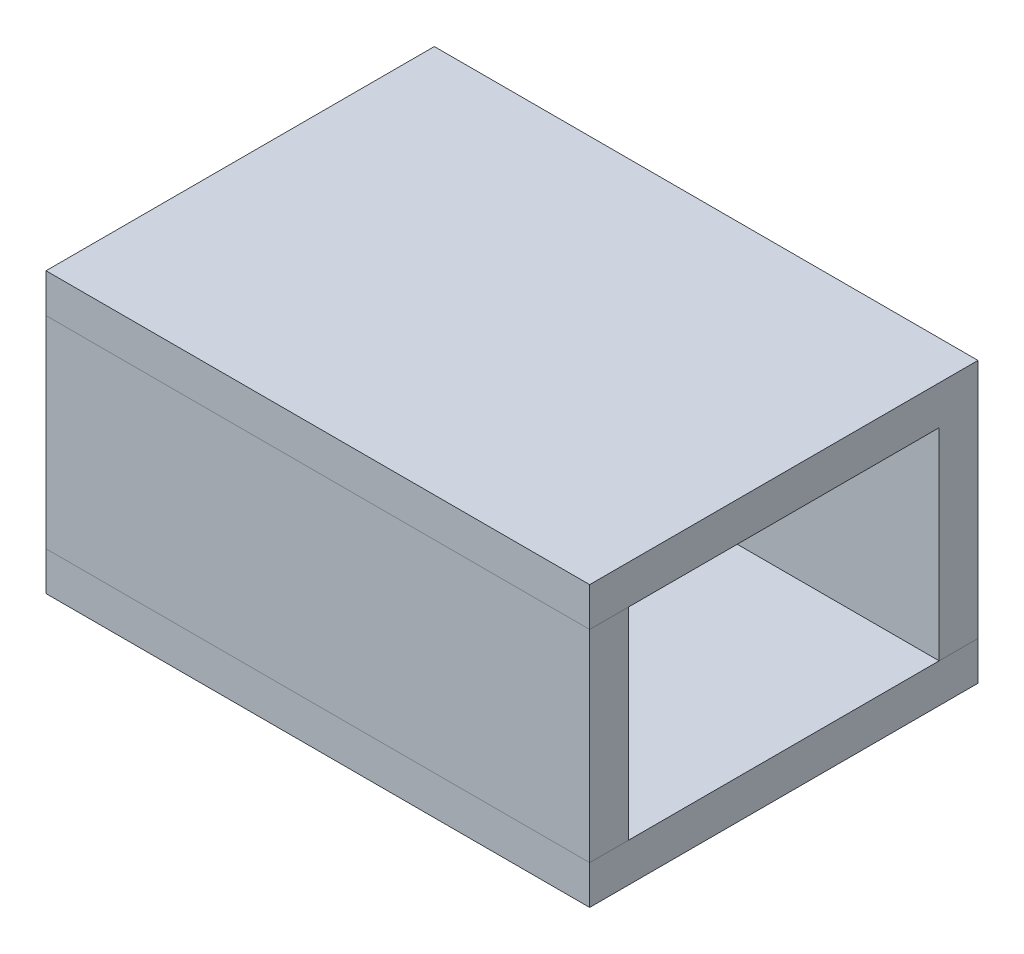
ISO-10303-21;
HEADER;
FILE_DESCRIPTION(('STEP AP214'),'2;1');
FILE_NAME('part.step','',(''),(''),'','','');
FILE_SCHEMA(('AUTOMOTIVE_DESIGN { 1 0 10303 214 1 1 1 1 }'));
ENDSEC;
DATA;
#1=APPLICATION_CONTEXT('core data for automotive mechanical design processes');
#2=APPLICATION_PROTOCOL_DEFINITION('international standard','automotive_design',2000,#1);
#3=PRODUCT_CONTEXT('',#1,'mechanical');
#4=PRODUCT('Part','Part','',(#3));
#5=PRODUCT_RELATED_PRODUCT_CATEGORY('part','',(#4));
#6=PRODUCT_DEFINITION_FORMATION('','',#4);
#7=PRODUCT_DEFINITION_CONTEXT('part definition',#1,'design');
#8=PRODUCT_DEFINITION('design','',#6,#7);
#9=PRODUCT_DEFINITION_SHAPE('','',#8);
#10=(LENGTH_UNIT() NAMED_UNIT(*) SI_UNIT(.MILLI.,.METRE.));
#11=(NAMED_UNIT(*) PLANE_ANGLE_UNIT() SI_UNIT($,.RADIAN.));
#12=(NAMED_UNIT(*) SI_UNIT($,.STERADIAN.) SOLID_ANGLE_UNIT());
#13=UNCERTAINTY_MEASURE_WITH_UNIT(LENGTH_MEASURE(1.E-05),#10,'distance_accuracy_value','');
#14=(GEOMETRIC_REPRESENTATION_CONTEXT(3) GLOBAL_UNCERTAINTY_ASSIGNED_CONTEXT((#13)) GLOBAL_UNIT_ASSIGNED_CONTEXT((#10,
#11,#12)) REPRESENTATION_CONTEXT('',''));
#15=CARTESIAN_POINT('',(0.,0.,0.));
#16=DIRECTION('',(0.,0.,1.));
#17=DIRECTION('',(1.,0.,0.));
#18=AXIS2_PLACEMENT_3D('',#15,#16,#17);
#19=CARTESIAN_POINT('',(0.,-6.5,10.));
#20=DIRECTION('',(0.,1.,0.));
#21=DIRECTION('',(0.,0.,1.));
#22=AXIS2_PLACEMENT_3D('',#19,#20,#21);
#23=PLANE('',#22);
#24=DIRECTION('',(0.,0.,-1.));
#25=VECTOR('',#24,1.);
#26=CARTESIAN_POINT('',(0.,-6.5,0.));
#27=LINE('',#26,#25);
#28=CARTESIAN_POINT('',(0.,-6.5,-10.));
#29=VERTEX_POINT('',#28);
#30=CARTESIAN_POINT('',(0.,-6.5,-12.5));
#31=VERTEX_POINT('',#30);
#32=EDGE_CURVE('E133',#29,#31,#27,.T.);
#33=ORIENTED_EDGE('',*,*,#32,.T.);
#34=DIRECTION('',(-1.,0.,0.));
#35=VECTOR('',#34,1.);
#36=CARTESIAN_POINT('',(35.,-6.5,-12.5));
#37=LINE('',#36,#35);
#38=CARTESIAN_POINT('',(35.,-6.5,-12.5));
#39=VERTEX_POINT('',#38);
#40=EDGE_CURVE('E71',#39,#31,#37,.T.);
#41=ORIENTED_EDGE('',*,*,#40,.F.);
#42=DIRECTION('',(0.,0.,-1.));
#43=VECTOR('',#42,1.);
#44=CARTESIAN_POINT('',(35.,-6.5,0.));
#45=LINE('',#44,#43);
#46=CARTESIAN_POINT('',(35.,-6.5,-10.));
#47=VERTEX_POINT('',#46);
#48=EDGE_CURVE('E79',#47,#39,#45,.T.);
#49=ORIENTED_EDGE('',*,*,#48,.F.);
#50=DIRECTION('',(-1.,0.,0.));
#51=VECTOR('',#50,1.);
#52=CARTESIAN_POINT('',(35.,-6.5,-10.));
#53=LINE('',#52,#51);
#54=EDGE_CURVE('E122',#47,#29,#53,.T.);
#55=ORIENTED_EDGE('',*,*,#54,.T.);
#56=EDGE_LOOP('',(#33,#41,#49,#55));
#57=FACE_BOUND('',#56,.T.);
#58=ADVANCED_FACE('F53',(#57),#23,.F.);
#59=CARTESIAN_POINT('',(35.,0.,0.));
#60=DIRECTION('',(-1.,0.,0.));
#61=DIRECTION('',(0.,0.,1.));
#62=AXIS2_PLACEMENT_3D('',#59,#60,#61);
#63=PLANE('',#62);
#64=DIRECTION('',(0.,1.,0.));
#65=VECTOR('',#64,1.);
#66=CARTESIAN_POINT('',(35.,-9.,-12.5));
#67=LINE('',#66,#65);
#68=CARTESIAN_POINT('',(35.,9.,-12.5));
#69=VERTEX_POINT('',#68);
#70=EDGE_CURVE('E57',#39,#69,#67,.T.);
#71=ORIENTED_EDGE('',*,*,#70,.T.);
#72=DIRECTION('',(0.,0.,1.));
#73=VECTOR('',#72,1.);
#74=CARTESIAN_POINT('',(35.,9.,12.5));
#75=LINE('',#74,#73);
#76=CARTESIAN_POINT('',(35.,9.,12.5));
#77=VERTEX_POINT('',#76);
#78=EDGE_CURVE('E160',#69,#77,#75,.T.);
#79=ORIENTED_EDGE('',*,*,#78,.T.);
#80=DIRECTION('',(0.,-1.,0.));
#81=VECTOR('',#80,1.);
#82=CARTESIAN_POINT('',(35.,-9.,12.5));
#83=LINE('',#82,#81);
#84=CARTESIAN_POINT('',(35.,6.5,12.5));
#85=VERTEX_POINT('',#84);
#86=EDGE_CURVE('E157',#77,#85,#83,.T.);
#87=ORIENTED_EDGE('',*,*,#86,.T.);
#88=DIRECTION('',(0.,0.,1.));
#89=VECTOR('',#88,1.);
#90=CARTESIAN_POINT('',(35.,6.5,0.));
#91=LINE('',#90,#89);
#92=CARTESIAN_POINT('',(35.,6.5,-10.));
#93=VERTEX_POINT('',#92);
#94=EDGE_CURVE('E151',#93,#85,#91,.T.);
#95=ORIENTED_EDGE('',*,*,#94,.F.);
#96=DIRECTION('',(0.,1.,0.));
#97=VECTOR('',#96,1.);
#98=CARTESIAN_POINT('',(35.,0.,-10.));
#99=LINE('',#98,#97);
#100=EDGE_CURVE('E63',#47,#93,#99,.T.);
#101=ORIENTED_EDGE('',*,*,#100,.F.);
#102=ORIENTED_EDGE('',*,*,#48,.T.);
#103=EDGE_LOOP('',(#71,#79,#87,#95,#101,#102));
#104=FACE_BOUND('',#103,.T.);
#105=ADVANCED_FACE('F189',(#104),#63,.F.);
#106=CARTESIAN_POINT('',(0.,0.,0.));
#107=DIRECTION('',(-1.,0.,0.));
#108=DIRECTION('',(0.,0.,1.));
#109=AXIS2_PLACEMENT_3D('',#106,#107,#108);
#110=PLANE('',#109);
#111=DIRECTION('',(0.,1.,0.));
#112=VECTOR('',#111,1.);
#113=CARTESIAN_POINT('',(0.,0.,-10.));
#114=LINE('',#113,#112);
#115=CARTESIAN_POINT('',(0.,6.5,-10.));
#116=VERTEX_POINT('',#115);
#117=EDGE_CURVE('E13',#29,#116,#114,.T.);
#118=ORIENTED_EDGE('',*,*,#117,.T.);
#119=DIRECTION('',(0.,0.,1.));
#120=VECTOR('',#119,1.);
#121=CARTESIAN_POINT('',(0.,6.5,0.));
#122=LINE('',#121,#120);
#123=CARTESIAN_POINT('',(0.,6.5,12.5));
#124=VERTEX_POINT('',#123);
#125=EDGE_CURVE('E110',#116,#124,#122,.T.);
#126=ORIENTED_EDGE('',*,*,#125,.T.);
#127=DIRECTION('',(0.,-1.,0.));
#128=VECTOR('',#127,1.);
#129=CARTESIAN_POINT('',(0.,-9.,12.5));
#130=LINE('',#129,#128);
#131=CARTESIAN_POINT('',(0.,9.,12.5));
#132=VERTEX_POINT('',#131);
#133=EDGE_CURVE('E162',#132,#124,#130,.T.);
#134=ORIENTED_EDGE('',*,*,#133,.F.);
#135=DIRECTION('',(0.,0.,1.));
#136=VECTOR('',#135,1.);
#137=CARTESIAN_POINT('',(0.,9.,12.5));
#138=LINE('',#137,#136);
#139=CARTESIAN_POINT('',(0.,9.,-12.5));
#140=VERTEX_POINT('',#139);
#141=EDGE_CURVE('E123',#140,#132,#138,.T.);
#142=ORIENTED_EDGE('',*,*,#141,.F.);
#143=DIRECTION('',(0.,1.,0.));
#144=VECTOR('',#143,1.);
#145=CARTESIAN_POINT('',(0.,-9.,-12.5));
#146=LINE('',#145,#144);
#147=EDGE_CURVE('E129',#31,#140,#146,.T.);
#148=ORIENTED_EDGE('',*,*,#147,.F.);
#149=ORIENTED_EDGE('',*,*,#32,.F.);
#150=EDGE_LOOP('',(#118,#126,#134,#142,#148,#149));
#151=FACE_BOUND('',#150,.T.);
#152=ADVANCED_FACE('F55',(#151),#110,.T.);
#153=CARTESIAN_POINT('',(35.,-9.,-10.));
#154=DIRECTION('',(0.,0.,1.));
#155=DIRECTION('',(1.,0.,0.));
#156=AXIS2_PLACEMENT_3D('',#153,#154,#155);
#157=PLANE('',#156);
#158=ORIENTED_EDGE('',*,*,#117,.F.);
#159=ORIENTED_EDGE('',*,*,#54,.F.);
#160=ORIENTED_EDGE('',*,*,#100,.T.);
#161=DIRECTION('',(-1.,0.,0.));
#162=VECTOR('',#161,1.);
#163=CARTESIAN_POINT('',(35.,6.5,-10.));
#164=LINE('',#163,#162);
#165=EDGE_CURVE('E114',#93,#116,#164,.T.);
#166=ORIENTED_EDGE('',*,*,#165,.T.);
#167=EDGE_LOOP('',(#158,#159,#160,#166));
#168=FACE_BOUND('',#167,.T.);
#169=ADVANCED_FACE('F127',(#168),#157,.T.);
#170=CARTESIAN_POINT('',(35.,-9.,-12.5));
#171=DIRECTION('',(0.,0.,1.));
#172=DIRECTION('',(1.,0.,0.));
#173=AXIS2_PLACEMENT_3D('',#170,#171,#172);
#174=PLANE('',#173);
#175=ORIENTED_EDGE('',*,*,#147,.T.);
#176=DIRECTION('',(-1.,0.,0.));
#177=VECTOR('',#176,1.);
#178=CARTESIAN_POINT('',(35.,9.,-12.5));
#179=LINE('',#178,#177);
#180=EDGE_CURVE('E154',#69,#140,#179,.T.);
#181=ORIENTED_EDGE('',*,*,#180,.F.);
#182=ORIENTED_EDGE('',*,*,#70,.F.);
#183=ORIENTED_EDGE('',*,*,#40,.T.);
#184=EDGE_LOOP('',(#175,#181,#182,#183));
#185=FACE_BOUND('',#184,.T.);
#186=ADVANCED_FACE('F177',(#185),#174,.F.);
#187=CARTESIAN_POINT('',(0.,6.5,-10.));
#188=DIRECTION('',(0.,-1.,0.));
#189=DIRECTION('',(0.,0.,-1.));
#190=AXIS2_PLACEMENT_3D('',#187,#188,#189);
#191=PLANE('',#190);
#192=DIRECTION('',(-1.,0.,0.));
#193=VECTOR('',#192,1.);
#194=CARTESIAN_POINT('',(35.,6.5,12.5));
#195=LINE('',#194,#193);
#196=EDGE_CURVE('E117',#85,#124,#195,.T.);
#197=ORIENTED_EDGE('',*,*,#196,.T.);
#198=ORIENTED_EDGE('',*,*,#125,.F.);
#199=ORIENTED_EDGE('',*,*,#165,.F.);
#200=ORIENTED_EDGE('',*,*,#94,.T.);
#201=EDGE_LOOP('',(#197,#198,#199,#200));
#202=FACE_BOUND('',#201,.T.);
#203=ADVANCED_FACE('F112',(#202),#191,.T.);
#204=CARTESIAN_POINT('',(35.,-9.,12.5));
#205=DIRECTION('',(0.,0.,-1.));
#206=DIRECTION('',(-1.,0.,0.));
#207=AXIS2_PLACEMENT_3D('',#204,#205,#206);
#208=PLANE('',#207);
#209=ORIENTED_EDGE('',*,*,#196,.F.);
#210=ORIENTED_EDGE('',*,*,#86,.F.);
#211=DIRECTION('',(-1.,0.,0.));
#212=VECTOR('',#211,1.);
#213=CARTESIAN_POINT('',(35.,9.,12.5));
#214=LINE('',#213,#212);
#215=EDGE_CURVE('E161',#77,#132,#214,.T.);
#216=ORIENTED_EDGE('',*,*,#215,.T.);
#217=ORIENTED_EDGE('',*,*,#133,.T.);
#218=EDGE_LOOP('',(#209,#210,#216,#217));
#219=FACE_BOUND('',#218,.T.);
#220=ADVANCED_FACE('F184',(#219),#208,.F.);
#221=CARTESIAN_POINT('',(35.,9.,12.5));
#222=DIRECTION('',(0.,-1.,0.));
#223=DIRECTION('',(0.,0.,-1.));
#224=AXIS2_PLACEMENT_3D('',#221,#222,#223);
#225=PLANE('',#224);
#226=ORIENTED_EDGE('',*,*,#141,.T.);
#227=ORIENTED_EDGE('',*,*,#215,.F.);
#228=ORIENTED_EDGE('',*,*,#78,.F.);
#229=ORIENTED_EDGE('',*,*,#180,.T.);
#230=EDGE_LOOP('',(#226,#227,#228,#229));
#231=FACE_BOUND('',#230,.T.);
#232=ADVANCED_FACE('F175',(#231),#225,.F.);
#233=CLOSED_SHELL('',(#58,#105,#152,#169,#186,#203,#220,#232));
#234=MANIFOLD_SOLID_BREP('B2',#233);
#235=CARTESIAN_POINT('',(0.,6.5,-10.));
#236=DIRECTION('',(0.,-1.,0.));
#237=DIRECTION('',(0.,0.,-1.));
#238=AXIS2_PLACEMENT_3D('',#235,#236,#237);
#239=PLANE('',#238);
#240=DIRECTION('',(-1.,0.,0.));
#241=VECTOR('',#240,1.);
#242=CARTESIAN_POINT('',(35.,6.5,10.));
#243=LINE('',#242,#241);
#244=CARTESIAN_POINT('',(35.,6.5,10.));
#245=VERTEX_POINT('',#244);
#246=CARTESIAN_POINT('',(0.,6.5,10.));
#247=VERTEX_POINT('',#246);
#248=EDGE_CURVE('E262',#245,#247,#243,.T.);
#249=ORIENTED_EDGE('',*,*,#248,.T.);
#250=DIRECTION('',(0.,0.,1.));
#251=VECTOR('',#250,1.);
#252=CARTESIAN_POINT('',(0.,6.5,0.));
#253=LINE('',#252,#251);
#254=CARTESIAN_POINT('',(0.,6.5,12.5));
#255=VERTEX_POINT('',#254);
#256=EDGE_CURVE('E308',#247,#255,#253,.T.);
#257=ORIENTED_EDGE('',*,*,#256,.T.);
#258=DIRECTION('',(-1.,0.,0.));
#259=VECTOR('',#258,1.);
#260=CARTESIAN_POINT('',(35.,6.5,12.5));
#261=LINE('',#260,#259);
#262=CARTESIAN_POINT('',(35.,6.5,12.5));
#263=VERTEX_POINT('',#262);
#264=EDGE_CURVE('E306',#263,#255,#261,.T.);
#265=ORIENTED_EDGE('',*,*,#264,.F.);
#266=DIRECTION('',(0.,0.,1.));
#267=VECTOR('',#266,1.);
#268=CARTESIAN_POINT('',(35.,6.5,0.));
#269=LINE('',#268,#267);
#270=EDGE_CURVE('E303',#245,#263,#269,.T.);
#271=ORIENTED_EDGE('',*,*,#270,.F.);
#272=EDGE_LOOP('',(#249,#257,#265,#271));
#273=FACE_BOUND('',#272,.T.);
#274=ADVANCED_FACE('F259',(#273),#239,.F.);
#275=CARTESIAN_POINT('',(0.,-6.5,10.));
#276=DIRECTION('',(0.,1.,0.));
#277=DIRECTION('',(0.,0.,1.));
#278=AXIS2_PLACEMENT_3D('',#275,#276,#277);
#279=PLANE('',#278);
#280=DIRECTION('',(1.,0.,0.));
#281=VECTOR('',#280,1.);
#282=CARTESIAN_POINT('',(35.,-6.5,12.5));
#283=LINE('',#282,#281);
#284=CARTESIAN_POINT('',(0.,-6.5,12.5));
#285=VERTEX_POINT('',#284);
#286=CARTESIAN_POINT('',(35.,-6.5,12.5));
#287=VERTEX_POINT('',#286);
#288=EDGE_CURVE('E318',#285,#287,#283,.T.);
#289=ORIENTED_EDGE('',*,*,#288,.F.);
#290=DIRECTION('',(0.,0.,-1.));
#291=VECTOR('',#290,1.);
#292=CARTESIAN_POINT('',(0.,-6.5,0.));
#293=LINE('',#292,#291);
#294=CARTESIAN_POINT('',(0.,-6.5,10.));
#295=VERTEX_POINT('',#294);
#296=EDGE_CURVE('E311',#285,#295,#293,.T.);
#297=ORIENTED_EDGE('',*,*,#296,.T.);
#298=DIRECTION('',(-1.,0.,0.));
#299=VECTOR('',#298,1.);
#300=CARTESIAN_POINT('',(35.,-6.5,10.));
#301=LINE('',#300,#299);
#302=CARTESIAN_POINT('',(35.,-6.5,10.));
#303=VERTEX_POINT('',#302);
#304=EDGE_CURVE('E275',#303,#295,#301,.T.);
#305=ORIENTED_EDGE('',*,*,#304,.F.);
#306=DIRECTION('',(0.,0.,-1.));
#307=VECTOR('',#306,1.);
#308=CARTESIAN_POINT('',(35.,-6.5,0.));
#309=LINE('',#308,#307);
#310=EDGE_CURVE('E283',#287,#303,#309,.T.);
#311=ORIENTED_EDGE('',*,*,#310,.F.);
#312=EDGE_LOOP('',(#289,#297,#305,#311));
#313=FACE_BOUND('',#312,.T.);
#314=ADVANCED_FACE('F328',(#313),#279,.F.);
#315=CARTESIAN_POINT('',(35.,0.,0.));
#316=DIRECTION('',(-1.,0.,0.));
#317=DIRECTION('',(0.,0.,1.));
#318=AXIS2_PLACEMENT_3D('',#315,#316,#317);
#319=PLANE('',#318);
#320=DIRECTION('',(0.,-1.,0.));
#321=VECTOR('',#320,1.);
#322=CARTESIAN_POINT('',(35.,0.,10.));
#323=LINE('',#322,#321);
#324=EDGE_CURVE('E267',#245,#303,#323,.T.);
#325=ORIENTED_EDGE('',*,*,#324,.F.);
#326=ORIENTED_EDGE('',*,*,#270,.T.);
#327=DIRECTION('',(0.,-1.,0.));
#328=VECTOR('',#327,1.);
#329=CARTESIAN_POINT('',(35.,-9.,12.5));
#330=LINE('',#329,#328);
#331=EDGE_CURVE('E321',#263,#287,#330,.T.);
#332=ORIENTED_EDGE('',*,*,#331,.T.);
#333=ORIENTED_EDGE('',*,*,#310,.T.);
#334=EDGE_LOOP('',(#325,#326,#332,#333));
#335=FACE_BOUND('',#334,.T.);
#336=ADVANCED_FACE('F312',(#335),#319,.F.);
#337=CARTESIAN_POINT('',(0.,0.,0.));
#338=DIRECTION('',(-1.,0.,0.));
#339=DIRECTION('',(0.,0.,1.));
#340=AXIS2_PLACEMENT_3D('',#337,#338,#339);
#341=PLANE('',#340);
#342=ORIENTED_EDGE('',*,*,#256,.F.);
#343=DIRECTION('',(0.,-1.,0.));
#344=VECTOR('',#343,1.);
#345=CARTESIAN_POINT('',(0.,0.,10.));
#346=LINE('',#345,#344);
#347=EDGE_CURVE('E51',#247,#295,#346,.T.);
#348=ORIENTED_EDGE('',*,*,#347,.T.);
#349=ORIENTED_EDGE('',*,*,#296,.F.);
#350=DIRECTION('',(0.,-1.,0.));
#351=VECTOR('',#350,1.);
#352=CARTESIAN_POINT('',(0.,-9.,12.5));
#353=LINE('',#352,#351);
#354=EDGE_CURVE('E314',#255,#285,#353,.T.);
#355=ORIENTED_EDGE('',*,*,#354,.F.);
#356=EDGE_LOOP('',(#342,#348,#349,#355));
#357=FACE_BOUND('',#356,.T.);
#358=ADVANCED_FACE('F331',(#357),#341,.T.);
#359=CARTESIAN_POINT('',(35.,-9.,10.));
#360=DIRECTION('',(0.,0.,-1.));
#361=DIRECTION('',(-1.,0.,0.));
#362=AXIS2_PLACEMENT_3D('',#359,#360,#361);
#363=PLANE('',#362);
#364=ORIENTED_EDGE('',*,*,#347,.F.);
#365=ORIENTED_EDGE('',*,*,#248,.F.);
#366=ORIENTED_EDGE('',*,*,#324,.T.);
#367=ORIENTED_EDGE('',*,*,#304,.T.);
#368=EDGE_LOOP('',(#364,#365,#366,#367));
#369=FACE_BOUND('',#368,.T.);
#370=ADVANCED_FACE('F310',(#369),#363,.T.);
#371=CARTESIAN_POINT('',(35.,-9.,12.5));
#372=DIRECTION('',(0.,0.,-1.));
#373=DIRECTION('',(-1.,0.,0.));
#374=AXIS2_PLACEMENT_3D('',#371,#372,#373);
#375=PLANE('',#374);
#376=ORIENTED_EDGE('',*,*,#331,.F.);
#377=ORIENTED_EDGE('',*,*,#264,.T.);
#378=ORIENTED_EDGE('',*,*,#354,.T.);
#379=ORIENTED_EDGE('',*,*,#288,.T.);
#380=EDGE_LOOP('',(#376,#377,#378,#379));
#381=FACE_BOUND('',#380,.T.);
#382=ADVANCED_FACE('F333',(#381),#375,.F.);
#383=CLOSED_SHELL('',(#274,#314,#336,#358,#370,#382));
#384=MANIFOLD_SOLID_BREP('B7_NOT_SHOWN',#383);
#385=CARTESIAN_POINT('',(35.,-6.5,12.5));
#386=DIRECTION('',(0.,1.,0.));
#387=DIRECTION('',(0.,0.,1.));
#388=AXIS2_PLACEMENT_3D('',#385,#386,#387);
#389=PLANE('',#388);
#390=DIRECTION('',(0.,0.,-1.));
#391=VECTOR('',#390,1.);
#392=CARTESIAN_POINT('',(0.,-6.5,0.));
#393=LINE('',#392,#391);
#394=CARTESIAN_POINT('',(0.,-6.5,12.5));
#395=VERTEX_POINT('',#394);
#396=CARTESIAN_POINT('',(0.,-6.5,-12.5));
#397=VERTEX_POINT('',#396);
#398=EDGE_CURVE('E397',#395,#397,#393,.T.);
#399=ORIENTED_EDGE('',*,*,#398,.F.);
#400=DIRECTION('',(1.,0.,0.));
#401=VECTOR('',#400,1.);
#402=CARTESIAN_POINT('',(35.,-6.5,12.5));
#403=LINE('',#402,#401);
#404=CARTESIAN_POINT('',(35.,-6.5,12.5));
#405=VERTEX_POINT('',#404);
#406=EDGE_CURVE('E257',#395,#405,#403,.T.);
#407=ORIENTED_EDGE('',*,*,#406,.T.);
#408=DIRECTION('',(0.,0.,-1.));
#409=VECTOR('',#408,1.);
#410=CARTESIAN_POINT('',(35.,-6.5,0.));
#411=LINE('',#410,#409);
#412=CARTESIAN_POINT('',(35.,-6.5,-12.5));
#413=VERTEX_POINT('',#412);
#414=EDGE_CURVE('E405',#405,#413,#411,.T.);
#415=ORIENTED_EDGE('',*,*,#414,.T.);
#416=DIRECTION('',(-1.,0.,0.));
#417=VECTOR('',#416,1.);
#418=CARTESIAN_POINT('',(35.,-6.5,-12.5));
#419=LINE('',#418,#417);
#420=EDGE_CURVE('E391',#413,#397,#419,.T.);
#421=ORIENTED_EDGE('',*,*,#420,.T.);
#422=EDGE_LOOP('',(#399,#407,#415,#421));
#423=FACE_BOUND('',#422,.T.);
#424=ADVANCED_FACE('F383',(#423),#389,.T.);
#425=CARTESIAN_POINT('',(35.,-9.,-12.5));
#426=DIRECTION('',(0.,0.,1.));
#427=DIRECTION('',(1.,0.,0.));
#428=AXIS2_PLACEMENT_3D('',#425,#426,#427);
#429=PLANE('',#428);
#430=ORIENTED_EDGE('',*,*,#420,.F.);
#431=DIRECTION('',(0.,1.,0.));
#432=VECTOR('',#431,1.);
#433=CARTESIAN_POINT('',(35.,-9.,-12.5));
#434=LINE('',#433,#432);
#435=CARTESIAN_POINT('',(35.,-9.,-12.5));
#436=VERTEX_POINT('',#435);
#437=EDGE_CURVE('E429',#436,#413,#434,.T.);
#438=ORIENTED_EDGE('',*,*,#437,.F.);
#439=DIRECTION('',(-1.,0.,0.));
#440=VECTOR('',#439,1.);
#441=CARTESIAN_POINT('',(35.,-9.,-12.5));
#442=LINE('',#441,#440);
#443=CARTESIAN_POINT('',(0.,-9.,-12.5));
#444=VERTEX_POINT('',#443);
#445=EDGE_CURVE('E437',#436,#444,#442,.T.);
#446=ORIENTED_EDGE('',*,*,#445,.T.);
#447=DIRECTION('',(0.,1.,0.));
#448=VECTOR('',#447,1.);
#449=CARTESIAN_POINT('',(0.,-9.,-12.5));
#450=LINE('',#449,#448);
#451=EDGE_CURVE('E446',#444,#397,#450,.T.);
#452=ORIENTED_EDGE('',*,*,#451,.T.);
#453=EDGE_LOOP('',(#430,#438,#446,#452));
#454=FACE_BOUND('',#453,.T.);
#455=ADVANCED_FACE('F385',(#454),#429,.F.);
#456=CARTESIAN_POINT('',(35.,-9.,12.5));
#457=DIRECTION('',(0.,1.,0.));
#458=DIRECTION('',(0.,0.,1.));
#459=AXIS2_PLACEMENT_3D('',#456,#457,#458);
#460=PLANE('',#459);
#461=DIRECTION('',(0.,0.,-1.));
#462=VECTOR('',#461,1.);
#463=CARTESIAN_POINT('',(0.,-9.,12.5));
#464=LINE('',#463,#462);
#465=CARTESIAN_POINT('',(0.,-9.,12.5));
#466=VERTEX_POINT('',#465);
#467=EDGE_CURVE('E450',#466,#444,#464,.T.);
#468=ORIENTED_EDGE('',*,*,#467,.T.);
#469=ORIENTED_EDGE('',*,*,#445,.F.);
#470=DIRECTION('',(0.,0.,-1.));
#471=VECTOR('',#470,1.);
#472=CARTESIAN_POINT('',(35.,-9.,12.5));
#473=LINE('',#472,#471);
#474=CARTESIAN_POINT('',(35.,-9.,12.5));
#475=VERTEX_POINT('',#474);
#476=EDGE_CURVE('E425',#475,#436,#473,.T.);
#477=ORIENTED_EDGE('',*,*,#476,.F.);
#478=DIRECTION('',(-1.,0.,0.));
#479=VECTOR('',#478,1.);
#480=CARTESIAN_POINT('',(35.,-9.,12.5));
#481=LINE('',#480,#479);
#482=EDGE_CURVE('E432',#475,#466,#481,.T.);
#483=ORIENTED_EDGE('',*,*,#482,.T.);
#484=EDGE_LOOP('',(#468,#469,#477,#483));
#485=FACE_BOUND('',#484,.T.);
#486=ADVANCED_FACE('F439',(#485),#460,.F.);
#487=CARTESIAN_POINT('',(35.,-9.,12.5));
#488=DIRECTION('',(0.,0.,-1.));
#489=DIRECTION('',(-1.,0.,0.));
#490=AXIS2_PLACEMENT_3D('',#487,#488,#489);
#491=PLANE('',#490);
#492=ORIENTED_EDGE('',*,*,#406,.F.);
#493=DIRECTION('',(0.,-1.,0.));
#494=VECTOR('',#493,1.);
#495=CARTESIAN_POINT('',(0.,-9.,12.5));
#496=LINE('',#495,#494);
#497=EDGE_CURVE('E434',#395,#466,#496,.T.);
#498=ORIENTED_EDGE('',*,*,#497,.T.);
#499=ORIENTED_EDGE('',*,*,#482,.F.);
#500=DIRECTION('',(0.,-1.,0.));
#501=VECTOR('',#500,1.);
#502=CARTESIAN_POINT('',(35.,-9.,12.5));
#503=LINE('',#502,#501);
#504=EDGE_CURVE('E421',#405,#475,#503,.T.);
#505=ORIENTED_EDGE('',*,*,#504,.F.);
#506=EDGE_LOOP('',(#492,#498,#499,#505));
#507=FACE_BOUND('',#506,.T.);
#508=ADVANCED_FACE('F433',(#507),#491,.F.);
#509=CARTESIAN_POINT('',(35.,0.,0.));
#510=DIRECTION('',(-1.,0.,0.));
#511=DIRECTION('',(0.,0.,1.));
#512=AXIS2_PLACEMENT_3D('',#509,#510,#511);
#513=PLANE('',#512);
#514=ORIENTED_EDGE('',*,*,#414,.F.);
#515=ORIENTED_EDGE('',*,*,#504,.T.);
#516=ORIENTED_EDGE('',*,*,#476,.T.);
#517=ORIENTED_EDGE('',*,*,#437,.T.);
#518=EDGE_LOOP('',(#514,#515,#516,#517));
#519=FACE_BOUND('',#518,.T.);
#520=ADVANCED_FACE('F423',(#519),#513,.F.);
#521=CARTESIAN_POINT('',(0.,0.,0.));
#522=DIRECTION('',(-1.,0.,0.));
#523=DIRECTION('',(0.,0.,1.));
#524=AXIS2_PLACEMENT_3D('',#521,#522,#523);
#525=PLANE('',#524);
#526=ORIENTED_EDGE('',*,*,#497,.F.);
#527=ORIENTED_EDGE('',*,*,#398,.T.);
#528=ORIENTED_EDGE('',*,*,#451,.F.);
#529=ORIENTED_EDGE('',*,*,#467,.F.);
#530=EDGE_LOOP('',(#526,#527,#528,#529));
#531=FACE_BOUND('',#530,.T.);
#532=ADVANCED_FACE('F455',(#531),#525,.T.);
#533=CLOSED_SHELL('',(#424,#455,#486,#508,#520,#532));
#534=MANIFOLD_SOLID_BREP('B45',#533);
#535=ADVANCED_BREP_SHAPE_REPRESENTATION('',(#18,#234,#384,#534),#14);
#536=SHAPE_DEFINITION_REPRESENTATION(#9,#535);
ENDSEC;
END-ISO-10303-21;
